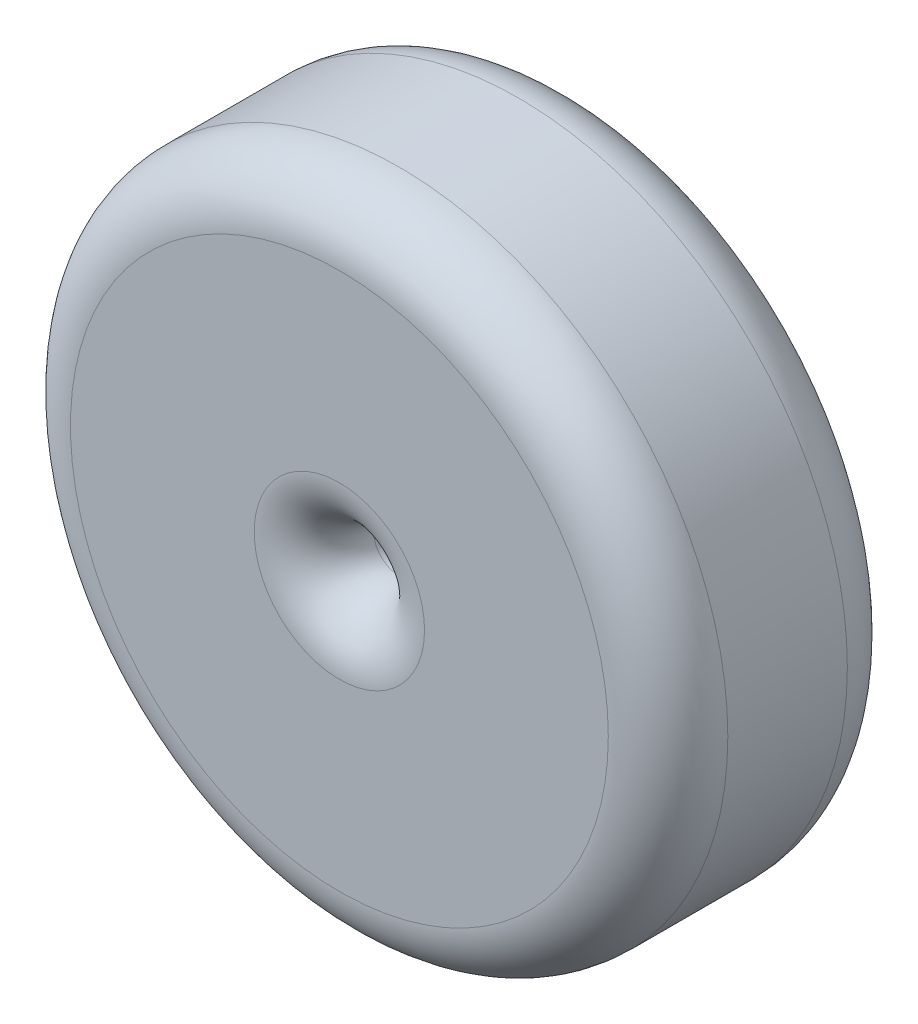
ISO-10303-21;
HEADER;
FILE_DESCRIPTION(('STEP AP214'),'2;1');
FILE_NAME('part.step','',(''),(''),'','','');
FILE_SCHEMA(('AUTOMOTIVE_DESIGN { 1 0 10303 214 1 1 1 1 }'));
ENDSEC;
DATA;
#1=APPLICATION_CONTEXT('core data for automotive mechanical design processes');
#2=APPLICATION_PROTOCOL_DEFINITION('international standard','automotive_design',2000,#1);
#3=PRODUCT_CONTEXT('',#1,'mechanical');
#4=PRODUCT('Part','Part','',(#3));
#5=PRODUCT_RELATED_PRODUCT_CATEGORY('part','',(#4));
#6=PRODUCT_DEFINITION_FORMATION('','',#4);
#7=PRODUCT_DEFINITION_CONTEXT('part definition',#1,'design');
#8=PRODUCT_DEFINITION('design','',#6,#7);
#9=PRODUCT_DEFINITION_SHAPE('','',#8);
#10=(LENGTH_UNIT() NAMED_UNIT(*) SI_UNIT(.MILLI.,.METRE.));
#11=(NAMED_UNIT(*) PLANE_ANGLE_UNIT() SI_UNIT($,.RADIAN.));
#12=(NAMED_UNIT(*) SI_UNIT($,.STERADIAN.) SOLID_ANGLE_UNIT());
#13=UNCERTAINTY_MEASURE_WITH_UNIT(LENGTH_MEASURE(1.E-05),#10,'distance_accuracy_value','');
#14=(GEOMETRIC_REPRESENTATION_CONTEXT(3) GLOBAL_UNCERTAINTY_ASSIGNED_CONTEXT((#13)) GLOBAL_UNIT_ASSIGNED_CONTEXT((#10,
#11,#12)) REPRESENTATION_CONTEXT('',''));
#15=CARTESIAN_POINT('',(0.,0.,0.));
#16=DIRECTION('',(0.,0.,1.));
#17=DIRECTION('',(1.,0.,0.));
#18=AXIS2_PLACEMENT_3D('',#15,#16,#17);
#19=CARTESIAN_POINT('',(0.,0.,8.));
#20=DIRECTION('',(0.,0.,1.));
#21=DIRECTION('',(1.,0.,0.));
#22=AXIS2_PLACEMENT_3D('',#19,#20,#21);
#23=PLANE('',#22);
#24=CARTESIAN_POINT('',(0.,0.,8.));
#25=DIRECTION('',(0.,0.,1.));
#26=DIRECTION('',(1.,0.,0.));
#27=AXIS2_PLACEMENT_3D('',#24,#25,#26);
#28=CIRCLE('',#27,5.7);
#29=CARTESIAN_POINT('',(5.7,0.,8.));
#30=VERTEX_POINT('',#29);
#31=EDGE_CURVE('E60',#30,#30,#28,.F.);
#32=ORIENTED_EDGE('',*,*,#31,.T.);
#33=EDGE_LOOP('',(#32));
#34=FACE_BOUND('',#33,.T.);
#35=CARTESIAN_POINT('',(0.,0.,8.));
#36=DIRECTION('',(0.,0.,1.));
#37=DIRECTION('',(1.,0.,0.));
#38=AXIS2_PLACEMENT_3D('',#35,#36,#37);
#39=CIRCLE('',#38,18.);
#40=CARTESIAN_POINT('',(18.,0.,8.));
#41=VERTEX_POINT('',#40);
#42=EDGE_CURVE('E62',#41,#41,#39,.T.);
#43=ORIENTED_EDGE('',*,*,#42,.T.);
#44=EDGE_LOOP('',(#43));
#45=FACE_BOUND('',#44,.T.);
#46=ADVANCED_FACE('F44',(#34,#45),#23,.T.);
#47=CARTESIAN_POINT('',(0.,0.,-8.));
#48=DIRECTION('',(0.,0.,1.));
#49=DIRECTION('',(1.,0.,0.));
#50=AXIS2_PLACEMENT_3D('',#47,#48,#49);
#51=PLANE('',#50);
#52=CARTESIAN_POINT('',(0.,0.,-8.));
#53=DIRECTION('',(0.,0.,1.));
#54=DIRECTION('',(1.,0.,0.));
#55=AXIS2_PLACEMENT_3D('',#52,#53,#54);
#56=CIRCLE('',#55,5.7);
#57=CARTESIAN_POINT('',(5.7,0.,-8.));
#58=VERTEX_POINT('',#57);
#59=EDGE_CURVE('E75',#58,#58,#56,.T.);
#60=ORIENTED_EDGE('',*,*,#59,.T.);
#61=EDGE_LOOP('',(#60));
#62=FACE_BOUND('',#61,.T.);
#63=CARTESIAN_POINT('',(0.,0.,-8.));
#64=DIRECTION('',(0.,0.,1.));
#65=DIRECTION('',(1.,0.,0.));
#66=AXIS2_PLACEMENT_3D('',#63,#64,#65);
#67=CIRCLE('',#66,18.);
#68=CARTESIAN_POINT('',(18.,0.,-8.));
#69=VERTEX_POINT('',#68);
#70=EDGE_CURVE('E74',#69,#69,#67,.F.);
#71=ORIENTED_EDGE('',*,*,#70,.T.);
#72=EDGE_LOOP('',(#71));
#73=FACE_BOUND('',#72,.T.);
#74=ADVANCED_FACE('F79',(#62,#73),#51,.F.);
#75=CARTESIAN_POINT('',(0.,0.,8.));
#76=DIRECTION('',(0.,0.,-1.));
#77=DIRECTION('',(-1.,0.,0.));
#78=AXIS2_PLACEMENT_3D('',#75,#76,#77);
#79=CYLINDRICAL_SURFACE('',#78,22.);
#80=CARTESIAN_POINT('',(0.,0.,-4.));
#81=DIRECTION('',(0.,0.,1.));
#82=DIRECTION('',(1.,0.,0.));
#83=AXIS2_PLACEMENT_3D('',#80,#81,#82);
#84=CIRCLE('',#83,22.);
#85=CARTESIAN_POINT('',(22.,0.,-4.));
#86=VERTEX_POINT('',#85);
#87=EDGE_CURVE('E10',#86,#86,#84,.T.);
#88=ORIENTED_EDGE('',*,*,#87,.T.);
#89=EDGE_LOOP('',(#88));
#90=FACE_BOUND('',#89,.T.);
#91=CARTESIAN_POINT('',(0.,0.,4.));
#92=DIRECTION('',(0.,0.,1.));
#93=DIRECTION('',(1.,0.,0.));
#94=AXIS2_PLACEMENT_3D('',#91,#92,#93);
#95=CIRCLE('',#94,22.);
#96=CARTESIAN_POINT('',(22.,0.,4.));
#97=VERTEX_POINT('',#96);
#98=EDGE_CURVE('E52',#97,#97,#95,.F.);
#99=ORIENTED_EDGE('',*,*,#98,.T.);
#100=EDGE_LOOP('',(#99));
#101=FACE_BOUND('',#100,.T.);
#102=ADVANCED_FACE('F96',(#90,#101),#79,.T.);
#103=CARTESIAN_POINT('',(0.,0.,8.));
#104=DIRECTION('',(0.,0.,-1.));
#105=DIRECTION('',(-1.,0.,0.));
#106=AXIS2_PLACEMENT_3D('',#103,#104,#105);
#107=CYLINDRICAL_SURFACE('',#106,1.7);
#108=CARTESIAN_POINT('',(0.,0.,-4.));
#109=DIRECTION('',(0.,0.,1.));
#110=DIRECTION('',(1.,0.,0.));
#111=AXIS2_PLACEMENT_3D('',#108,#109,#110);
#112=CIRCLE('',#111,1.7);
#113=CARTESIAN_POINT('',(1.7,0.,-4.));
#114=VERTEX_POINT('',#113);
#115=EDGE_CURVE('E68',#114,#114,#112,.F.);
#116=ORIENTED_EDGE('',*,*,#115,.T.);
#117=EDGE_LOOP('',(#116));
#118=FACE_BOUND('',#117,.T.);
#119=CARTESIAN_POINT('',(0.,0.,4.));
#120=DIRECTION('',(0.,0.,1.));
#121=DIRECTION('',(1.,0.,0.));
#122=AXIS2_PLACEMENT_3D('',#119,#120,#121);
#123=CIRCLE('',#122,1.7);
#124=CARTESIAN_POINT('',(1.7,0.,4.));
#125=VERTEX_POINT('',#124);
#126=EDGE_CURVE('E70',#125,#125,#123,.T.);
#127=ORIENTED_EDGE('',*,*,#126,.T.);
#128=EDGE_LOOP('',(#127));
#129=FACE_BOUND('',#128,.T.);
#130=ADVANCED_FACE('F106',(#118,#129),#107,.F.);
#131=CARTESIAN_POINT('',(0.,0.,-4.));
#132=DIRECTION('',(0.,0.,1.));
#133=DIRECTION('',(1.,0.,0.));
#134=AXIS2_PLACEMENT_3D('',#131,#132,#133);
#135=TOROIDAL_SURFACE('',#134,5.7,4.);
#136=ORIENTED_EDGE('',*,*,#115,.F.);
#137=EDGE_LOOP('',(#136));
#138=FACE_BOUND('',#137,.T.);
#139=ORIENTED_EDGE('',*,*,#59,.F.);
#140=EDGE_LOOP('',(#139));
#141=FACE_BOUND('',#140,.T.);
#142=ADVANCED_FACE('F90',(#138,#141),#135,.T.);
#143=CARTESIAN_POINT('',(0.,0.,4.));
#144=DIRECTION('',(0.,0.,1.));
#145=DIRECTION('',(1.,0.,0.));
#146=AXIS2_PLACEMENT_3D('',#143,#144,#145);
#147=TOROIDAL_SURFACE('',#146,5.7,4.);
#148=ORIENTED_EDGE('',*,*,#31,.F.);
#149=EDGE_LOOP('',(#148));
#150=FACE_BOUND('',#149,.T.);
#151=ORIENTED_EDGE('',*,*,#126,.F.);
#152=EDGE_LOOP('',(#151));
#153=FACE_BOUND('',#152,.T.);
#154=ADVANCED_FACE('F81',(#150,#153),#147,.T.);
#155=CARTESIAN_POINT('',(0.,0.,-4.));
#156=DIRECTION('',(0.,0.,1.));
#157=DIRECTION('',(1.,0.,0.));
#158=AXIS2_PLACEMENT_3D('',#155,#156,#157);
#159=TOROIDAL_SURFACE('',#158,18.,4.);
#160=ORIENTED_EDGE('',*,*,#70,.F.);
#161=EDGE_LOOP('',(#160));
#162=FACE_BOUND('',#161,.T.);
#163=ORIENTED_EDGE('',*,*,#87,.F.);
#164=EDGE_LOOP('',(#163));
#165=FACE_BOUND('',#164,.T.);
#166=ADVANCED_FACE('F82',(#162,#165),#159,.T.);
#167=CARTESIAN_POINT('',(0.,0.,4.));
#168=DIRECTION('',(0.,0.,1.));
#169=DIRECTION('',(1.,0.,0.));
#170=AXIS2_PLACEMENT_3D('',#167,#168,#169);
#171=TOROIDAL_SURFACE('',#170,18.,4.);
#172=ORIENTED_EDGE('',*,*,#98,.F.);
#173=EDGE_LOOP('',(#172));
#174=FACE_BOUND('',#173,.T.);
#175=ORIENTED_EDGE('',*,*,#42,.F.);
#176=EDGE_LOOP('',(#175));
#177=FACE_BOUND('',#176,.T.);
#178=ADVANCED_FACE('F48',(#174,#177),#171,.T.);
#179=CLOSED_SHELL('',(#46,#74,#102,#130,#142,#154,#166,#178));
#180=MANIFOLD_SOLID_BREP('B2',#179);
#181=ADVANCED_BREP_SHAPE_REPRESENTATION('',(#18,#180),#14);
#182=SHAPE_DEFINITION_REPRESENTATION(#9,#181);
ENDSEC;
END-ISO-10303-21;
